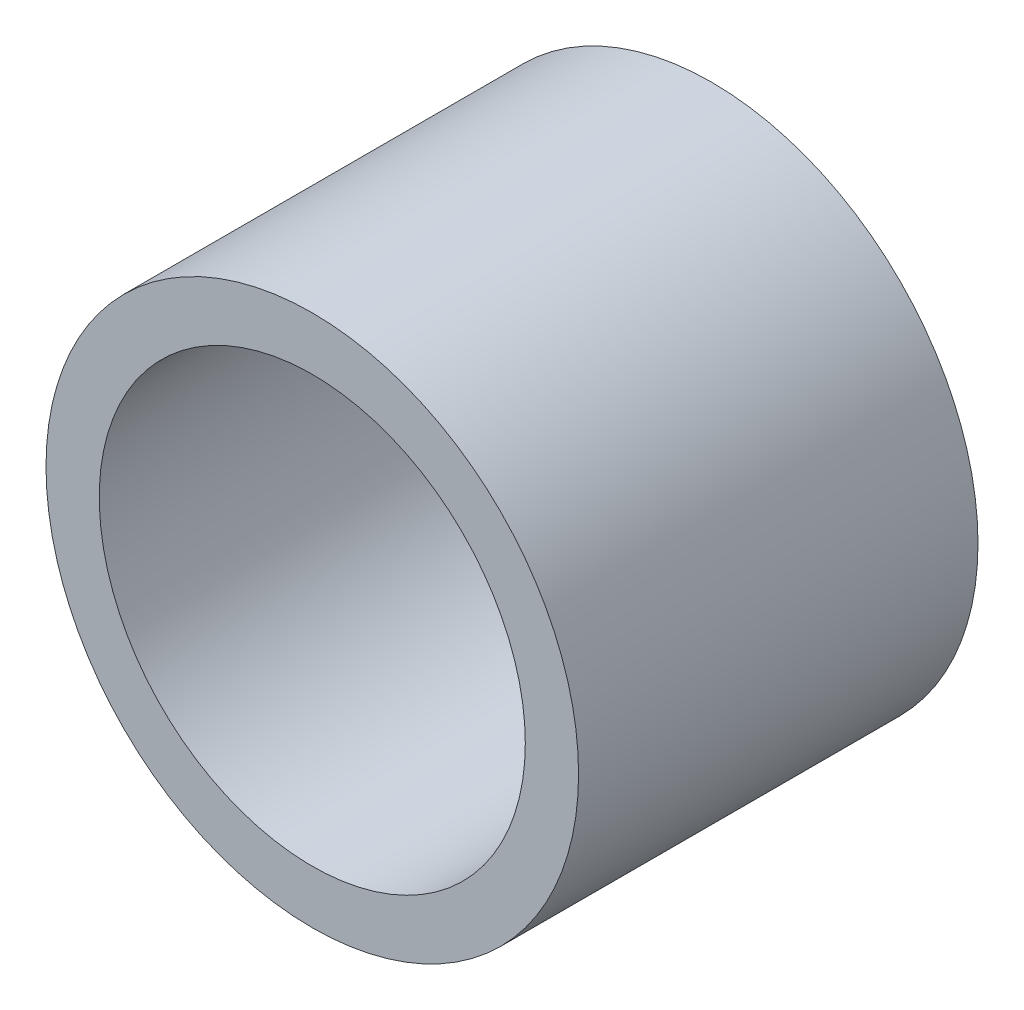
ISO-10303-21;
HEADER;
FILE_DESCRIPTION(('STEP AP214'),'2;1');
FILE_NAME('part.step','',(''),(''),'','','');
FILE_SCHEMA(('AUTOMOTIVE_DESIGN { 1 0 10303 214 1 1 1 1 }'));
ENDSEC;
DATA;
#1=APPLICATION_CONTEXT('core data for automotive mechanical design processes');
#2=APPLICATION_PROTOCOL_DEFINITION('international standard','automotive_design',2000,#1);
#3=PRODUCT_CONTEXT('',#1,'mechanical');
#4=PRODUCT('Part','Part','',(#3));
#5=PRODUCT_RELATED_PRODUCT_CATEGORY('part','',(#4));
#6=PRODUCT_DEFINITION_FORMATION('','',#4);
#7=PRODUCT_DEFINITION_CONTEXT('part definition',#1,'design');
#8=PRODUCT_DEFINITION('design','',#6,#7);
#9=PRODUCT_DEFINITION_SHAPE('','',#8);
#10=(LENGTH_UNIT() NAMED_UNIT(*) SI_UNIT(.MILLI.,.METRE.));
#11=(NAMED_UNIT(*) PLANE_ANGLE_UNIT() SI_UNIT($,.RADIAN.));
#12=(NAMED_UNIT(*) SI_UNIT($,.STERADIAN.) SOLID_ANGLE_UNIT());
#13=UNCERTAINTY_MEASURE_WITH_UNIT(LENGTH_MEASURE(1.E-05),#10,'distance_accuracy_value','');
#14=(GEOMETRIC_REPRESENTATION_CONTEXT(3) GLOBAL_UNCERTAINTY_ASSIGNED_CONTEXT((#13)) GLOBAL_UNIT_ASSIGNED_CONTEXT((#10,
#11,#12)) REPRESENTATION_CONTEXT('',''));
#15=CARTESIAN_POINT('',(0.,0.,0.));
#16=DIRECTION('',(0.,0.,1.));
#17=DIRECTION('',(1.,0.,0.));
#18=AXIS2_PLACEMENT_3D('',#15,#16,#17);
#19=CARTESIAN_POINT('',(213.803411798075,-339.866155143762,7.5));
#20=DIRECTION('',(0.,0.,1.));
#21=DIRECTION('',(1.,0.,0.));
#22=AXIS2_PLACEMENT_3D('',#19,#20,#21);
#23=PLANE('',#22);
#24=CARTESIAN_POINT('',(213.803411798075,-339.866155143762,7.5));
#25=DIRECTION('',(0.,0.,1.));
#26=DIRECTION('',(1.,0.,0.));
#27=AXIS2_PLACEMENT_3D('',#24,#25,#26);
#28=CIRCLE('',#27,4.99999999999999);
#29=CARTESIAN_POINT('',(218.803411798075,-339.866155143762,7.5));
#30=VERTEX_POINT('',#29);
#31=EDGE_CURVE('E10',#30,#30,#28,.T.);
#32=ORIENTED_EDGE('',*,*,#31,.T.);
#33=EDGE_LOOP('',(#32));
#34=FACE_BOUND('',#33,.T.);
#35=CARTESIAN_POINT('',(213.803411798075,-339.866155143762,7.5));
#36=DIRECTION('',(0.,0.,1.));
#37=DIRECTION('',(1.,0.,0.));
#38=AXIS2_PLACEMENT_3D('',#35,#36,#37);
#39=CIRCLE('',#38,3.99999999999998);
#40=CARTESIAN_POINT('',(217.803411798075,-339.866155143762,7.5));
#41=VERTEX_POINT('',#40);
#42=EDGE_CURVE('E41',#41,#41,#39,.T.);
#43=ORIENTED_EDGE('',*,*,#42,.F.);
#44=EDGE_LOOP('',(#43));
#45=FACE_BOUND('',#44,.T.);
#46=ADVANCED_FACE('F30',(#34,#45),#23,.T.);
#47=CARTESIAN_POINT('',(213.803411798075,-339.866155143762,0.));
#48=DIRECTION('',(0.,0.,1.));
#49=DIRECTION('',(1.,0.,0.));
#50=AXIS2_PLACEMENT_3D('',#47,#48,#49);
#51=PLANE('',#50);
#52=CARTESIAN_POINT('',(213.803411798075,-339.866155143762,0.));
#53=DIRECTION('',(0.,0.,1.));
#54=DIRECTION('',(1.,0.,0.));
#55=AXIS2_PLACEMENT_3D('',#52,#53,#54);
#56=CIRCLE('',#55,4.99999999999999);
#57=CARTESIAN_POINT('',(218.803411798075,-339.866155143762,0.));
#58=VERTEX_POINT('',#57);
#59=EDGE_CURVE('E34',#58,#58,#56,.T.);
#60=ORIENTED_EDGE('',*,*,#59,.F.);
#61=EDGE_LOOP('',(#60));
#62=FACE_BOUND('',#61,.T.);
#63=CARTESIAN_POINT('',(213.803411798075,-339.866155143762,0.));
#64=DIRECTION('',(0.,0.,1.));
#65=DIRECTION('',(1.,0.,0.));
#66=AXIS2_PLACEMENT_3D('',#63,#64,#65);
#67=CIRCLE('',#66,3.99999999999998);
#68=CARTESIAN_POINT('',(217.803411798075,-339.866155143762,0.));
#69=VERTEX_POINT('',#68);
#70=EDGE_CURVE('E43',#69,#69,#67,.T.);
#71=ORIENTED_EDGE('',*,*,#70,.T.);
#72=EDGE_LOOP('',(#71));
#73=FACE_BOUND('',#72,.T.);
#74=ADVANCED_FACE('F53',(#62,#73),#51,.F.);
#75=CARTESIAN_POINT('',(213.803411798075,-339.866155143762,7.5));
#76=DIRECTION('',(0.,0.,-1.));
#77=DIRECTION('',(-1.,0.,0.));
#78=AXIS2_PLACEMENT_3D('',#75,#76,#77);
#79=CYLINDRICAL_SURFACE('',#78,4.99999999999999);
#80=ORIENTED_EDGE('',*,*,#31,.F.);
#81=EDGE_LOOP('',(#80));
#82=FACE_BOUND('',#81,.T.);
#83=ORIENTED_EDGE('',*,*,#59,.T.);
#84=EDGE_LOOP('',(#83));
#85=FACE_BOUND('',#84,.T.);
#86=ADVANCED_FACE('F32',(#82,#85),#79,.T.);
#87=CARTESIAN_POINT('',(213.803411798075,-339.866155143762,7.5));
#88=DIRECTION('',(0.,0.,-1.));
#89=DIRECTION('',(-1.,0.,0.));
#90=AXIS2_PLACEMENT_3D('',#87,#88,#89);
#91=CYLINDRICAL_SURFACE('',#90,3.99999999999998);
#92=ORIENTED_EDGE('',*,*,#42,.T.);
#93=EDGE_LOOP('',(#92));
#94=FACE_BOUND('',#93,.T.);
#95=ORIENTED_EDGE('',*,*,#70,.F.);
#96=EDGE_LOOP('',(#95));
#97=FACE_BOUND('',#96,.T.);
#98=ADVANCED_FACE('F49',(#94,#97),#91,.F.);
#99=CLOSED_SHELL('',(#46,#74,#86,#98));
#100=MANIFOLD_SOLID_BREP('B2',#99);
#101=ADVANCED_BREP_SHAPE_REPRESENTATION('',(#18,#100),#14);
#102=SHAPE_DEFINITION_REPRESENTATION(#9,#101);
ENDSEC;
END-ISO-10303-21;
